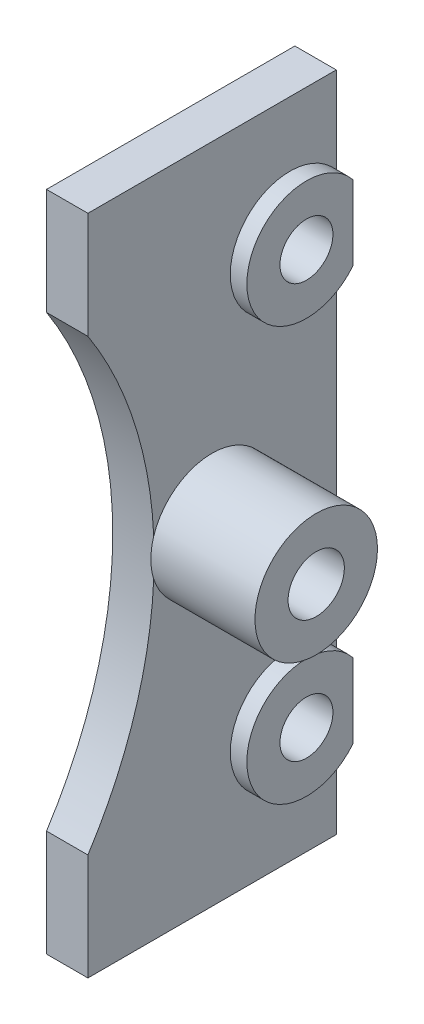
ISO-10303-21;
HEADER;
FILE_DESCRIPTION(('STEP AP214'),'2;1');
FILE_NAME('part.step','',(''),(''),'','','');
FILE_SCHEMA(('AUTOMOTIVE_DESIGN { 1 0 10303 214 1 1 1 1 }'));
ENDSEC;
DATA;
#1=APPLICATION_CONTEXT('core data for automotive mechanical design processes');
#2=APPLICATION_PROTOCOL_DEFINITION('international standard','automotive_design',2000,#1);
#3=PRODUCT_CONTEXT('',#1,'mechanical');
#4=PRODUCT('Part','Part','',(#3));
#5=PRODUCT_RELATED_PRODUCT_CATEGORY('part','',(#4));
#6=PRODUCT_DEFINITION_FORMATION('','',#4);
#7=PRODUCT_DEFINITION_CONTEXT('part definition',#1,'design');
#8=PRODUCT_DEFINITION('design','',#6,#7);
#9=PRODUCT_DEFINITION_SHAPE('','',#8);
#10=(LENGTH_UNIT() NAMED_UNIT(*) SI_UNIT(.MILLI.,.METRE.));
#11=(NAMED_UNIT(*) PLANE_ANGLE_UNIT() SI_UNIT($,.RADIAN.));
#12=(NAMED_UNIT(*) SI_UNIT($,.STERADIAN.) SOLID_ANGLE_UNIT());
#13=UNCERTAINTY_MEASURE_WITH_UNIT(LENGTH_MEASURE(1.E-05),#10,'distance_accuracy_value','');
#14=(GEOMETRIC_REPRESENTATION_CONTEXT(3) GLOBAL_UNCERTAINTY_ASSIGNED_CONTEXT((#13)) GLOBAL_UNIT_ASSIGNED_CONTEXT((#10,
#11,#12)) REPRESENTATION_CONTEXT('',''));
#15=CARTESIAN_POINT('',(0.,0.,0.));
#16=DIRECTION('',(0.,0.,1.));
#17=DIRECTION('',(1.,0.,0.));
#18=AXIS2_PLACEMENT_3D('',#15,#16,#17);
#19=CARTESIAN_POINT('',(-7.5,0.,0.));
#20=DIRECTION('',(0.,0.,1.));
#21=DIRECTION('',(-1.,0.,0.));
#22=AXIS2_PLACEMENT_3D('',#19,#20,#21);
#23=PLANE('',#22);
#24=DIRECTION('',(-1.,0.,0.));
#25=VECTOR('',#24,1.);
#26=CARTESIAN_POINT('',(-2.5,33.5646599662505,0.));
#27=LINE('',#26,#25);
#28=CARTESIAN_POINT('',(-2.5,33.5646599662505,0.));
#29=VERTEX_POINT('',#28);
#30=CARTESIAN_POINT('',(-5.,33.5646599662505,0.));
#31=VERTEX_POINT('',#30);
#32=EDGE_CURVE('E181',#29,#31,#27,.T.);
#33=ORIENTED_EDGE('',*,*,#32,.F.);
#34=DIRECTION('',(0.,1.,0.));
#35=VECTOR('',#34,1.);
#36=CARTESIAN_POINT('',(-2.5,0.,0.));
#37=LINE('',#36,#35);
#38=CARTESIAN_POINT('',(-2.5,40.,0.));
#39=VERTEX_POINT('',#38);
#40=EDGE_CURVE('E210',#29,#39,#37,.T.);
#41=ORIENTED_EDGE('',*,*,#40,.T.);
#42=DIRECTION('',(1.,0.,0.));
#43=VECTOR('',#42,1.);
#44=CARTESIAN_POINT('',(-7.5,40.,0.));
#45=LINE('',#44,#43);
#46=CARTESIAN_POINT('',(-5.,40.,0.));
#47=VERTEX_POINT('',#46);
#48=EDGE_CURVE('E228',#47,#39,#45,.T.);
#49=ORIENTED_EDGE('',*,*,#48,.F.);
#50=DIRECTION('',(0.,1.,0.));
#51=VECTOR('',#50,1.);
#52=CARTESIAN_POINT('',(-5.,0.,0.));
#53=LINE('',#52,#51);
#54=EDGE_CURVE('E188',#31,#47,#53,.T.);
#55=ORIENTED_EDGE('',*,*,#54,.F.);
#56=EDGE_LOOP('',(#33,#41,#49,#55));
#57=FACE_BOUND('',#56,.T.);
#58=ADVANCED_FACE('F56',(#57),#23,.T.);
#59=CARTESIAN_POINT('',(-7.5,0.,0.));
#60=DIRECTION('',(0.,1.,0.));
#61=DIRECTION('',(0.,0.,1.));
#62=AXIS2_PLACEMENT_3D('',#59,#60,#61);
#63=PLANE('',#62);
#64=DIRECTION('',(0.,0.,1.));
#65=VECTOR('',#64,1.);
#66=CARTESIAN_POINT('',(-5.,0.,0.));
#67=LINE('',#66,#65);
#68=CARTESIAN_POINT('',(-5.,0.,-15.));
#69=VERTEX_POINT('',#68);
#70=CARTESIAN_POINT('',(-5.,0.,0.));
#71=VERTEX_POINT('',#70);
#72=EDGE_CURVE('E197',#69,#71,#67,.T.);
#73=ORIENTED_EDGE('',*,*,#72,.F.);
#74=DIRECTION('',(1.,0.,0.));
#75=VECTOR('',#74,1.);
#76=CARTESIAN_POINT('',(-7.5,0.,-15.));
#77=LINE('',#76,#75);
#78=CARTESIAN_POINT('',(-2.5,0.,-15.));
#79=VERTEX_POINT('',#78);
#80=EDGE_CURVE('E233',#69,#79,#77,.T.);
#81=ORIENTED_EDGE('',*,*,#80,.T.);
#82=DIRECTION('',(0.,0.,-1.));
#83=VECTOR('',#82,1.);
#84=CARTESIAN_POINT('',(-2.5,0.,0.));
#85=LINE('',#84,#83);
#86=CARTESIAN_POINT('',(-2.5,0.,0.));
#87=VERTEX_POINT('',#86);
#88=EDGE_CURVE('E215',#87,#79,#85,.T.);
#89=ORIENTED_EDGE('',*,*,#88,.F.);
#90=DIRECTION('',(1.,0.,0.));
#91=VECTOR('',#90,1.);
#92=CARTESIAN_POINT('',(-7.5,0.,0.));
#93=LINE('',#92,#91);
#94=EDGE_CURVE('E226',#71,#87,#93,.T.);
#95=ORIENTED_EDGE('',*,*,#94,.F.);
#96=EDGE_LOOP('',(#73,#81,#89,#95));
#97=FACE_BOUND('',#96,.T.);
#98=ADVANCED_FACE('F58',(#97),#63,.F.);
#99=CARTESIAN_POINT('',(-7.5,0.,-15.));
#100=DIRECTION('',(0.,0.,1.));
#101=DIRECTION('',(-1.,0.,0.));
#102=AXIS2_PLACEMENT_3D('',#99,#100,#101);
#103=PLANE('',#102);
#104=DIRECTION('',(0.,-1.,0.));
#105=VECTOR('',#104,1.);
#106=CARTESIAN_POINT('',(-5.,0.,-15.));
#107=LINE('',#106,#105);
#108=CARTESIAN_POINT('',(-5.,40.,-15.));
#109=VERTEX_POINT('',#108);
#110=EDGE_CURVE('E195',#109,#69,#107,.T.);
#111=ORIENTED_EDGE('',*,*,#110,.F.);
#112=DIRECTION('',(1.,0.,0.));
#113=VECTOR('',#112,1.);
#114=CARTESIAN_POINT('',(-7.5,40.,-15.));
#115=LINE('',#114,#113);
#116=CARTESIAN_POINT('',(-2.5,40.,-15.));
#117=VERTEX_POINT('',#116);
#118=EDGE_CURVE('E231',#109,#117,#115,.T.);
#119=ORIENTED_EDGE('',*,*,#118,.T.);
#120=DIRECTION('',(0.,1.,0.));
#121=VECTOR('',#120,1.);
#122=CARTESIAN_POINT('',(-2.5,0.,-15.));
#123=LINE('',#122,#121);
#124=CARTESIAN_POINT('',(-2.5,34.762741699797,-15.));
#125=VERTEX_POINT('',#124);
#126=EDGE_CURVE('E218',#125,#117,#123,.T.);
#127=ORIENTED_EDGE('',*,*,#126,.F.);
#128=DIRECTION('',(-1.,0.,0.));
#129=VECTOR('',#128,1.);
#130=CARTESIAN_POINT('',(-1.5,34.762741699797,-15.));
#131=LINE('',#130,#129);
#132=CARTESIAN_POINT('',(-1.5,34.762741699797,-15.));
#133=VERTEX_POINT('',#132);
#134=EDGE_CURVE('E73',#133,#125,#131,.T.);
#135=ORIENTED_EDGE('',*,*,#134,.F.);
#136=DIRECTION('',(0.,-1.,0.));
#137=VECTOR('',#136,1.);
#138=CARTESIAN_POINT('',(-1.5,0.,-15.));
#139=LINE('',#138,#137);
#140=CARTESIAN_POINT('',(-1.5,30.237258300203,-15.));
#141=VERTEX_POINT('',#140);
#142=EDGE_CURVE('E151',#133,#141,#139,.T.);
#143=ORIENTED_EDGE('',*,*,#142,.T.);
#144=DIRECTION('',(-1.,0.,0.));
#145=VECTOR('',#144,1.);
#146=CARTESIAN_POINT('',(-1.5,30.237258300203,-15.));
#147=LINE('',#146,#145);
#148=CARTESIAN_POINT('',(-2.5,30.237258300203,-15.));
#149=VERTEX_POINT('',#148);
#150=EDGE_CURVE('E140',#141,#149,#147,.T.);
#151=ORIENTED_EDGE('',*,*,#150,.T.);
#152=CARTESIAN_POINT('',(-2.5,9.76274169979695,-15.));
#153=VERTEX_POINT('',#152);
#154=EDGE_CURVE('E223',#153,#149,#123,.T.);
#155=ORIENTED_EDGE('',*,*,#154,.F.);
#156=DIRECTION('',(-1.,0.,0.));
#157=VECTOR('',#156,1.);
#158=CARTESIAN_POINT('',(-1.5,9.76274169979695,-15.));
#159=LINE('',#158,#157);
#160=CARTESIAN_POINT('',(-1.5,9.76274169979695,-15.));
#161=VERTEX_POINT('',#160);
#162=EDGE_CURVE('E81',#161,#153,#159,.T.);
#163=ORIENTED_EDGE('',*,*,#162,.F.);
#164=DIRECTION('',(0.,-1.,0.));
#165=VECTOR('',#164,1.);
#166=CARTESIAN_POINT('',(-1.5,0.,-15.));
#167=LINE('',#166,#165);
#168=CARTESIAN_POINT('',(-1.5,5.23725830020304,-15.));
#169=VERTEX_POINT('',#168);
#170=EDGE_CURVE('E168',#161,#169,#167,.T.);
#171=ORIENTED_EDGE('',*,*,#170,.T.);
#172=DIRECTION('',(-1.,0.,0.));
#173=VECTOR('',#172,1.);
#174=CARTESIAN_POINT('',(-1.5,5.23725830020304,-15.));
#175=LINE('',#174,#173);
#176=CARTESIAN_POINT('',(-2.5,5.23725830020304,-15.));
#177=VERTEX_POINT('',#176);
#178=EDGE_CURVE('E173',#169,#177,#175,.T.);
#179=ORIENTED_EDGE('',*,*,#178,.T.);
#180=EDGE_CURVE('E219',#79,#177,#123,.T.);
#181=ORIENTED_EDGE('',*,*,#180,.F.);
#182=ORIENTED_EDGE('',*,*,#80,.F.);
#183=EDGE_LOOP('',(#111,#119,#127,#135,#143,#151,#155,#163,#171,#179,#181,#182));
#184=FACE_BOUND('',#183,.T.);
#185=ADVANCED_FACE('F153',(#184),#103,.F.);
#186=CARTESIAN_POINT('',(-7.5,40.,0.));
#187=DIRECTION('',(0.,1.,0.));
#188=DIRECTION('',(0.,0.,1.));
#189=AXIS2_PLACEMENT_3D('',#186,#187,#188);
#190=PLANE('',#189);
#191=ORIENTED_EDGE('',*,*,#118,.F.);
#192=DIRECTION('',(0.,0.,-1.));
#193=VECTOR('',#192,1.);
#194=CARTESIAN_POINT('',(-5.,40.,0.));
#195=LINE('',#194,#193);
#196=EDGE_CURVE('E193',#47,#109,#195,.T.);
#197=ORIENTED_EDGE('',*,*,#196,.F.);
#198=ORIENTED_EDGE('',*,*,#48,.T.);
#199=DIRECTION('',(0.,0.,-1.));
#200=VECTOR('',#199,1.);
#201=CARTESIAN_POINT('',(-2.5,40.,0.));
#202=LINE('',#201,#200);
#203=EDGE_CURVE('E222',#39,#117,#202,.T.);
#204=ORIENTED_EDGE('',*,*,#203,.T.);
#205=EDGE_LOOP('',(#191,#197,#198,#204));
#206=FACE_BOUND('',#205,.T.);
#207=ADVANCED_FACE('F264',(#206),#190,.T.);
#208=CARTESIAN_POINT('',(-7.5,32.5,-12.2));
#209=DIRECTION('',(1.,0.,0.));
#210=DIRECTION('',(0.,0.,1.));
#211=AXIS2_PLACEMENT_3D('',#208,#209,#210);
#212=CYLINDRICAL_SURFACE('',#211,1.6);
#213=CARTESIAN_POINT('',(-5.,32.5,-12.2));
#214=DIRECTION('',(-1.,0.,0.));
#215=DIRECTION('',(0.,0.,1.));
#216=AXIS2_PLACEMENT_3D('',#213,#214,#215);
#217=CIRCLE('',#216,1.6);
#218=CARTESIAN_POINT('',(-5.,32.5,-10.6));
#219=VERTEX_POINT('',#218);
#220=EDGE_CURVE('E202',#219,#219,#217,.T.);
#221=ORIENTED_EDGE('',*,*,#220,.T.);
#222=EDGE_LOOP('',(#221));
#223=FACE_BOUND('',#222,.T.);
#224=CARTESIAN_POINT('',(-1.5,32.5,-12.2));
#225=DIRECTION('',(-1.,0.,0.));
#226=DIRECTION('',(0.,0.,1.));
#227=AXIS2_PLACEMENT_3D('',#224,#225,#226);
#228=CIRCLE('',#227,1.6);
#229=CARTESIAN_POINT('',(-1.5,32.5,-10.6));
#230=VERTEX_POINT('',#229);
#231=EDGE_CURVE('E156',#230,#230,#228,.F.);
#232=ORIENTED_EDGE('',*,*,#231,.T.);
#233=EDGE_LOOP('',(#232));
#234=FACE_BOUND('',#233,.T.);
#235=ADVANCED_FACE('F300',(#223,#234),#212,.F.);
#236=CARTESIAN_POINT('',(-7.5,20.,-7.5));
#237=DIRECTION('',(1.,0.,0.));
#238=DIRECTION('',(0.,0.,1.));
#239=AXIS2_PLACEMENT_3D('',#236,#237,#238);
#240=CYLINDRICAL_SURFACE('',#239,1.7);
#241=CARTESIAN_POINT('',(3.79,20.,-7.5));
#242=DIRECTION('',(1.,0.,0.));
#243=DIRECTION('',(0.,0.,-1.));
#244=AXIS2_PLACEMENT_3D('',#241,#242,#243);
#245=CIRCLE('',#244,1.7);
#246=CARTESIAN_POINT('',(3.79,20.,-9.2));
#247=VERTEX_POINT('',#246);
#248=EDGE_CURVE('E205',#247,#247,#245,.T.);
#249=ORIENTED_EDGE('',*,*,#248,.T.);
#250=EDGE_LOOP('',(#249));
#251=FACE_BOUND('',#250,.T.);
#252=CARTESIAN_POINT('',(-5.,20.,-7.5));
#253=DIRECTION('',(-1.,0.,0.));
#254=DIRECTION('',(0.,0.,1.));
#255=AXIS2_PLACEMENT_3D('',#252,#253,#254);
#256=CIRCLE('',#255,1.7);
#257=CARTESIAN_POINT('',(-5.,20.,-5.8));
#258=VERTEX_POINT('',#257);
#259=EDGE_CURVE('E199',#258,#258,#256,.T.);
#260=ORIENTED_EDGE('',*,*,#259,.T.);
#261=EDGE_LOOP('',(#260));
#262=FACE_BOUND('',#261,.T.);
#263=ADVANCED_FACE('F293',(#251,#262),#240,.F.);
#264=DIRECTION('',(-1.,0.,0.));
#265=VECTOR('',#264,1.);
#266=CARTESIAN_POINT('',(-2.5,6.43534003374946,0.));
#267=LINE('',#266,#265);
#268=CARTESIAN_POINT('',(-2.5,6.43534003374946,0.));
#269=VERTEX_POINT('',#268);
#270=CARTESIAN_POINT('',(-5.,6.43534003374946,0.));
#271=VERTEX_POINT('',#270);
#272=EDGE_CURVE('E185',#269,#271,#267,.T.);
#273=ORIENTED_EDGE('',*,*,#272,.T.);
#274=EDGE_CURVE('E190',#71,#271,#53,.T.);
#275=ORIENTED_EDGE('',*,*,#274,.F.);
#276=ORIENTED_EDGE('',*,*,#94,.T.);
#277=EDGE_CURVE('E212',#87,#269,#37,.T.);
#278=ORIENTED_EDGE('',*,*,#277,.T.);
#279=EDGE_LOOP('',(#273,#275,#276,#278));
#280=FACE_BOUND('',#279,.T.);
#281=ADVANCED_FACE('F268',(#280),#23,.T.);
#282=CARTESIAN_POINT('',(-7.5,7.5,-12.2));
#283=DIRECTION('',(1.,0.,0.));
#284=DIRECTION('',(0.,0.,1.));
#285=AXIS2_PLACEMENT_3D('',#282,#283,#284);
#286=CYLINDRICAL_SURFACE('',#285,1.6);
#287=CARTESIAN_POINT('',(-5.,7.5,-12.2));
#288=DIRECTION('',(-1.,0.,0.));
#289=DIRECTION('',(0.,0.,1.));
#290=AXIS2_PLACEMENT_3D('',#287,#288,#289);
#291=CIRCLE('',#290,1.6);
#292=CARTESIAN_POINT('',(-5.,7.5,-10.6));
#293=VERTEX_POINT('',#292);
#294=EDGE_CURVE('E60',#293,#293,#291,.T.);
#295=ORIENTED_EDGE('',*,*,#294,.T.);
#296=EDGE_LOOP('',(#295));
#297=FACE_BOUND('',#296,.T.);
#298=CARTESIAN_POINT('',(-1.5,7.5,-12.2));
#299=DIRECTION('',(-1.,0.,0.));
#300=DIRECTION('',(0.,0.,1.));
#301=AXIS2_PLACEMENT_3D('',#298,#299,#300);
#302=CIRCLE('',#301,1.6);
#303=CARTESIAN_POINT('',(-1.5,7.5,-10.6));
#304=VERTEX_POINT('',#303);
#305=EDGE_CURVE('E165',#304,#304,#302,.F.);
#306=ORIENTED_EDGE('',*,*,#305,.T.);
#307=EDGE_LOOP('',(#306));
#308=FACE_BOUND('',#307,.T.);
#309=ADVANCED_FACE('F292',(#297,#308),#286,.F.);
#310=CARTESIAN_POINT('',(-2.5,0.,0.));
#311=DIRECTION('',(-1.,0.,0.));
#312=DIRECTION('',(0.,0.,-1.));
#313=AXIS2_PLACEMENT_3D('',#310,#311,#312);
#314=PLANE('',#313);
#315=ORIENTED_EDGE('',*,*,#154,.T.);
#316=CARTESIAN_POINT('',(-2.5,32.5,-12.2));
#317=DIRECTION('',(-1.,0.,0.));
#318=DIRECTION('',(0.,0.,1.));
#319=AXIS2_PLACEMENT_3D('',#316,#317,#318);
#320=CIRCLE('',#319,3.6);
#321=EDGE_CURVE('E145',#149,#125,#320,.T.);
#322=ORIENTED_EDGE('',*,*,#321,.T.);
#323=ORIENTED_EDGE('',*,*,#126,.T.);
#324=ORIENTED_EDGE('',*,*,#203,.F.);
#325=ORIENTED_EDGE('',*,*,#40,.F.);
#326=CARTESIAN_POINT('',(-2.5,20.,21.));
#327=DIRECTION('',(-1.,0.,0.));
#328=DIRECTION('',(0.,0.,1.));
#329=AXIS2_PLACEMENT_3D('',#326,#327,#328);
#330=CIRCLE('',#329,25.);
#331=CARTESIAN_POINT('',(-2.5,21.1236190046408,-3.97473684210527));
#332=VERTEX_POINT('',#331);
#333=EDGE_CURVE('E178',#29,#332,#330,.T.);
#334=ORIENTED_EDGE('',*,*,#333,.T.);
#335=CARTESIAN_POINT('',(-2.5,20.,-7.5));
#336=DIRECTION('',(1.,0.,0.));
#337=DIRECTION('',(0.,0.,-1.));
#338=AXIS2_PLACEMENT_3D('',#335,#336,#337);
#339=CIRCLE('',#338,3.7);
#340=CARTESIAN_POINT('',(-2.5,18.8763809953592,-3.97473684210527));
#341=VERTEX_POINT('',#340);
#342=EDGE_CURVE('E65',#341,#332,#339,.T.);
#343=ORIENTED_EDGE('',*,*,#342,.F.);
#344=EDGE_CURVE('E183',#341,#269,#330,.T.);
#345=ORIENTED_EDGE('',*,*,#344,.T.);
#346=ORIENTED_EDGE('',*,*,#277,.F.);
#347=ORIENTED_EDGE('',*,*,#88,.T.);
#348=ORIENTED_EDGE('',*,*,#180,.T.);
#349=CARTESIAN_POINT('',(-2.5,7.5,-12.2));
#350=DIRECTION('',(-1.,0.,0.));
#351=DIRECTION('',(0.,0.,1.));
#352=AXIS2_PLACEMENT_3D('',#349,#350,#351);
#353=CIRCLE('',#352,3.6);
#354=EDGE_CURVE('E163',#177,#153,#353,.T.);
#355=ORIENTED_EDGE('',*,*,#354,.T.);
#356=EDGE_LOOP('',(#315,#322,#323,#324,#325,#334,#343,#345,#346,#347,#348,#355));
#357=FACE_BOUND('',#356,.T.);
#358=ADVANCED_FACE('F245',(#357),#314,.F.);
#359=CARTESIAN_POINT('',(3.79,20.,-7.5));
#360=DIRECTION('',(1.,0.,0.));
#361=DIRECTION('',(0.,0.,-1.));
#362=AXIS2_PLACEMENT_3D('',#359,#360,#361);
#363=PLANE('',#362);
#364=CARTESIAN_POINT('',(3.79,20.,-7.5));
#365=DIRECTION('',(1.,0.,0.));
#366=DIRECTION('',(0.,0.,-1.));
#367=AXIS2_PLACEMENT_3D('',#364,#365,#366);
#368=CIRCLE('',#367,3.7);
#369=CARTESIAN_POINT('',(3.79,20.,-11.2));
#370=VERTEX_POINT('',#369);
#371=EDGE_CURVE('E208',#370,#370,#368,.T.);
#372=ORIENTED_EDGE('',*,*,#371,.T.);
#373=EDGE_LOOP('',(#372));
#374=FACE_BOUND('',#373,.T.);
#375=ORIENTED_EDGE('',*,*,#248,.F.);
#376=EDGE_LOOP('',(#375));
#377=FACE_BOUND('',#376,.T.);
#378=ADVANCED_FACE('F311',(#374,#377),#363,.T.);
#379=CARTESIAN_POINT('',(3.79,20.,-7.5));
#380=DIRECTION('',(-1.,0.,0.));
#381=DIRECTION('',(0.,0.,1.));
#382=AXIS2_PLACEMENT_3D('',#379,#380,#381);
#383=CYLINDRICAL_SURFACE('',#382,3.7);
#384=ORIENTED_EDGE('',*,*,#371,.F.);
#385=EDGE_LOOP('',(#384));
#386=FACE_BOUND('',#385,.T.);
#387=EDGE_CURVE('E12',#332,#341,#339,.T.);
#388=ORIENTED_EDGE('',*,*,#387,.T.);
#389=ORIENTED_EDGE('',*,*,#342,.T.);
#390=EDGE_LOOP('',(#388,#389));
#391=FACE_BOUND('',#390,.T.);
#392=ADVANCED_FACE('F242',(#386,#391),#383,.T.);
#393=CARTESIAN_POINT('',(-5.,0.,0.));
#394=DIRECTION('',(-1.,0.,0.));
#395=DIRECTION('',(0.,0.,1.));
#396=AXIS2_PLACEMENT_3D('',#393,#394,#395);
#397=PLANE('',#396);
#398=CARTESIAN_POINT('',(-5.,20.,21.));
#399=DIRECTION('',(-1.,0.,0.));
#400=DIRECTION('',(0.,0.,1.));
#401=AXIS2_PLACEMENT_3D('',#398,#399,#400);
#402=CIRCLE('',#401,25.);
#403=EDGE_CURVE('E176',#31,#271,#402,.T.);
#404=ORIENTED_EDGE('',*,*,#403,.F.);
#405=ORIENTED_EDGE('',*,*,#54,.T.);
#406=ORIENTED_EDGE('',*,*,#196,.T.);
#407=ORIENTED_EDGE('',*,*,#110,.T.);
#408=ORIENTED_EDGE('',*,*,#72,.T.);
#409=ORIENTED_EDGE('',*,*,#274,.T.);
#410=EDGE_LOOP('',(#404,#405,#406,#407,#408,#409));
#411=FACE_BOUND('',#410,.T.);
#412=ORIENTED_EDGE('',*,*,#220,.F.);
#413=EDGE_LOOP('',(#412));
#414=FACE_BOUND('',#413,.T.);
#415=ORIENTED_EDGE('',*,*,#259,.F.);
#416=EDGE_LOOP('',(#415));
#417=FACE_BOUND('',#416,.T.);
#418=ORIENTED_EDGE('',*,*,#294,.F.);
#419=EDGE_LOOP('',(#418));
#420=FACE_BOUND('',#419,.T.);
#421=ADVANCED_FACE('F260',(#411,#414,#417,#420),#397,.T.);
#422=CARTESIAN_POINT('',(-2.5,0.,0.));
#423=DIRECTION('',(-1.,0.,0.));
#424=DIRECTION('',(0.,0.,1.));
#425=AXIS2_PLACEMENT_3D('',#422,#423,#424);
#426=PLANE('',#425);
#427=ORIENTED_EDGE('',*,*,#387,.F.);
#428=EDGE_CURVE('E182',#332,#341,#330,.T.);
#429=ORIENTED_EDGE('',*,*,#428,.T.);
#430=EDGE_LOOP('',(#427,#429));
#431=FACE_BOUND('',#430,.T.);
#432=ADVANCED_FACE('F281',(#431),#426,.T.);
#433=CARTESIAN_POINT('',(-2.5,20.,21.));
#434=DIRECTION('',(-1.,0.,0.));
#435=DIRECTION('',(0.,0.,1.));
#436=AXIS2_PLACEMENT_3D('',#433,#434,#435);
#437=CYLINDRICAL_SURFACE('',#436,25.);
#438=ORIENTED_EDGE('',*,*,#403,.T.);
#439=ORIENTED_EDGE('',*,*,#272,.F.);
#440=ORIENTED_EDGE('',*,*,#344,.F.);
#441=ORIENTED_EDGE('',*,*,#428,.F.);
#442=ORIENTED_EDGE('',*,*,#333,.F.);
#443=ORIENTED_EDGE('',*,*,#32,.T.);
#444=EDGE_LOOP('',(#438,#439,#440,#441,#442,#443));
#445=FACE_BOUND('',#444,.T.);
#446=ADVANCED_FACE('F252',(#445),#437,.F.);
#447=CARTESIAN_POINT('',(-1.5,7.5,-12.2));
#448=DIRECTION('',(-1.,0.,0.));
#449=DIRECTION('',(0.,0.,1.));
#450=AXIS2_PLACEMENT_3D('',#447,#448,#449);
#451=CYLINDRICAL_SURFACE('',#450,3.6);
#452=ORIENTED_EDGE('',*,*,#354,.F.);
#453=ORIENTED_EDGE('',*,*,#178,.F.);
#454=CARTESIAN_POINT('',(-1.5,7.5,-12.2));
#455=DIRECTION('',(-1.,0.,0.));
#456=DIRECTION('',(0.,0.,1.));
#457=AXIS2_PLACEMENT_3D('',#454,#455,#456);
#458=CIRCLE('',#457,3.6);
#459=EDGE_CURVE('E171',#169,#161,#458,.T.);
#460=ORIENTED_EDGE('',*,*,#459,.T.);
#461=ORIENTED_EDGE('',*,*,#162,.T.);
#462=EDGE_LOOP('',(#452,#453,#460,#461));
#463=FACE_BOUND('',#462,.T.);
#464=ADVANCED_FACE('F271',(#463),#451,.T.);
#465=CARTESIAN_POINT('',(-1.5,0.,0.));
#466=DIRECTION('',(-1.,0.,0.));
#467=DIRECTION('',(0.,0.,1.));
#468=AXIS2_PLACEMENT_3D('',#465,#466,#467);
#469=PLANE('',#468);
#470=ORIENTED_EDGE('',*,*,#305,.F.);
#471=EDGE_LOOP('',(#470));
#472=FACE_BOUND('',#471,.T.);
#473=ORIENTED_EDGE('',*,*,#170,.F.);
#474=ORIENTED_EDGE('',*,*,#459,.F.);
#475=EDGE_LOOP('',(#473,#474));
#476=FACE_BOUND('',#475,.T.);
#477=ADVANCED_FACE('F273',(#472,#476),#469,.F.);
#478=CARTESIAN_POINT('',(-1.5,32.5,-12.2));
#479=DIRECTION('',(-1.,0.,0.));
#480=DIRECTION('',(0.,0.,1.));
#481=AXIS2_PLACEMENT_3D('',#478,#479,#480);
#482=CYLINDRICAL_SURFACE('',#481,3.6);
#483=ORIENTED_EDGE('',*,*,#321,.F.);
#484=ORIENTED_EDGE('',*,*,#150,.F.);
#485=CARTESIAN_POINT('',(-1.5,32.5,-12.2));
#486=DIRECTION('',(-1.,0.,0.));
#487=DIRECTION('',(0.,0.,1.));
#488=AXIS2_PLACEMENT_3D('',#485,#486,#487);
#489=CIRCLE('',#488,3.6);
#490=EDGE_CURVE('E144',#141,#133,#489,.T.);
#491=ORIENTED_EDGE('',*,*,#490,.T.);
#492=ORIENTED_EDGE('',*,*,#134,.T.);
#493=EDGE_LOOP('',(#483,#484,#491,#492));
#494=FACE_BOUND('',#493,.T.);
#495=ADVANCED_FACE('F142',(#494),#482,.T.);
#496=CARTESIAN_POINT('',(-1.5,0.,0.));
#497=DIRECTION('',(-1.,0.,0.));
#498=DIRECTION('',(0.,0.,1.));
#499=AXIS2_PLACEMENT_3D('',#496,#497,#498);
#500=PLANE('',#499);
#501=ORIENTED_EDGE('',*,*,#231,.F.);
#502=EDGE_LOOP('',(#501));
#503=FACE_BOUND('',#502,.T.);
#504=ORIENTED_EDGE('',*,*,#142,.F.);
#505=ORIENTED_EDGE('',*,*,#490,.F.);
#506=EDGE_LOOP('',(#504,#505));
#507=FACE_BOUND('',#506,.T.);
#508=ADVANCED_FACE('F158',(#503,#507),#500,.F.);
#509=CLOSED_SHELL('',(#58,#98,#185,#207,#235,#263,#281,#309,#358,#378,#392,#421,#432,#446,#464,
#477,#495,#508));
#510=MANIFOLD_SOLID_BREP('B2',#509);
#511=ADVANCED_BREP_SHAPE_REPRESENTATION('',(#18,#510),#14);
#512=SHAPE_DEFINITION_REPRESENTATION(#9,#511);
ENDSEC;
END-ISO-10303-21;
